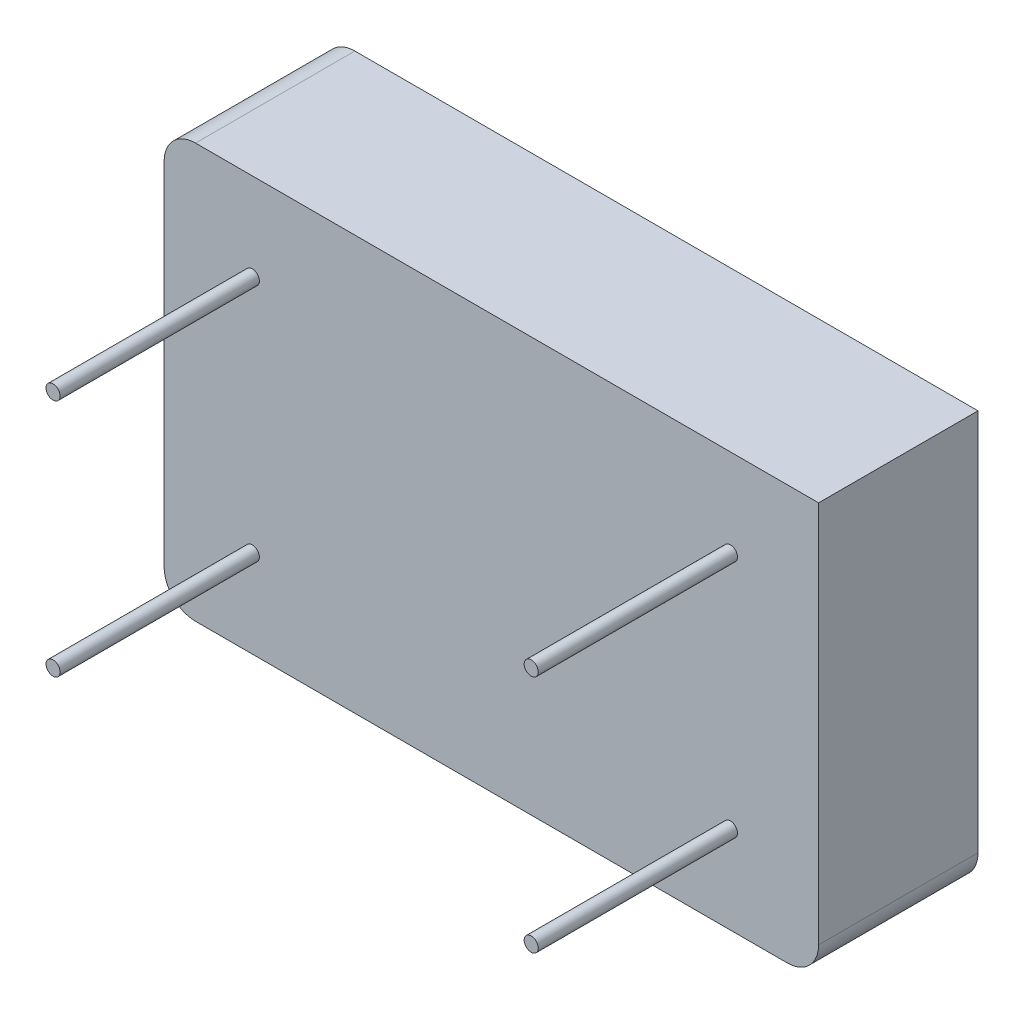
ISO-10303-21;
HEADER;
FILE_DESCRIPTION(('STEP AP214'),'2;1');
FILE_NAME('part.step','',(''),(''),'','','');
FILE_SCHEMA(('AUTOMOTIVE_DESIGN { 1 0 10303 214 1 1 1 1 }'));
ENDSEC;
DATA;
#1=APPLICATION_CONTEXT('core data for automotive mechanical design processes');
#2=APPLICATION_PROTOCOL_DEFINITION('international standard','automotive_design',2000,#1);
#3=PRODUCT_CONTEXT('',#1,'mechanical');
#4=PRODUCT('Part','Part','',(#3));
#5=PRODUCT_RELATED_PRODUCT_CATEGORY('part','',(#4));
#6=PRODUCT_DEFINITION_FORMATION('','',#4);
#7=PRODUCT_DEFINITION_CONTEXT('part definition',#1,'design');
#8=PRODUCT_DEFINITION('design','',#6,#7);
#9=PRODUCT_DEFINITION_SHAPE('','',#8);
#10=(LENGTH_UNIT() NAMED_UNIT(*) SI_UNIT(.MILLI.,.METRE.));
#11=(NAMED_UNIT(*) PLANE_ANGLE_UNIT() SI_UNIT($,.RADIAN.));
#12=(NAMED_UNIT(*) SI_UNIT($,.STERADIAN.) SOLID_ANGLE_UNIT());
#13=UNCERTAINTY_MEASURE_WITH_UNIT(LENGTH_MEASURE(1.E-05),#10,'distance_accuracy_value','');
#14=(GEOMETRIC_REPRESENTATION_CONTEXT(3) GLOBAL_UNCERTAINTY_ASSIGNED_CONTEXT((#13)) GLOBAL_UNIT_ASSIGNED_CONTEXT((#10,
#11,#12)) REPRESENTATION_CONTEXT('',''));
#15=CARTESIAN_POINT('',(0.,0.,0.));
#16=DIRECTION('',(0.,0.,1.));
#17=DIRECTION('',(1.,0.,0.));
#18=AXIS2_PLACEMENT_3D('',#15,#16,#17);
#19=CARTESIAN_POINT('',(0.,0.,5.08));
#20=DIRECTION('',(1.,0.,0.));
#21=DIRECTION('',(0.,0.,-1.));
#22=AXIS2_PLACEMENT_3D('',#19,#20,#21);
#23=PLANE('',#22);
#24=DIRECTION('',(0.,-1.,0.));
#25=VECTOR('',#24,1.);
#26=CARTESIAN_POINT('',(0.,0.,0.));
#27=LINE('',#26,#25);
#28=CARTESIAN_POINT('',(0.,12.2,0.));
#29=VERTEX_POINT('',#28);
#30=CARTESIAN_POINT('',(0.,1.,0.));
#31=VERTEX_POINT('',#30);
#32=EDGE_CURVE('E127',#29,#31,#27,.T.);
#33=ORIENTED_EDGE('',*,*,#32,.T.);
#34=DIRECTION('',(0.,0.,-1.));
#35=VECTOR('',#34,1.);
#36=CARTESIAN_POINT('',(0.,1.,5.08));
#37=LINE('',#36,#35);
#38=CARTESIAN_POINT('',(0.,1.,5.08));
#39=VERTEX_POINT('',#38);
#40=EDGE_CURVE('E46',#31,#39,#37,.F.);
#41=ORIENTED_EDGE('',*,*,#40,.T.);
#42=DIRECTION('',(0.,-1.,0.));
#43=VECTOR('',#42,1.);
#44=CARTESIAN_POINT('',(0.,0.,5.08));
#45=LINE('',#44,#43);
#46=CARTESIAN_POINT('',(0.,12.2,5.08));
#47=VERTEX_POINT('',#46);
#48=EDGE_CURVE('E139',#47,#39,#45,.T.);
#49=ORIENTED_EDGE('',*,*,#48,.F.);
#50=DIRECTION('',(0.,0.,-1.));
#51=VECTOR('',#50,1.);
#52=CARTESIAN_POINT('',(0.,12.2,5.08));
#53=LINE('',#52,#51);
#54=EDGE_CURVE('E182',#47,#29,#53,.T.);
#55=ORIENTED_EDGE('',*,*,#54,.T.);
#56=EDGE_LOOP('',(#33,#41,#49,#55));
#57=FACE_BOUND('',#56,.T.);
#58=ADVANCED_FACE('F37',(#57),#23,.F.);
#59=CARTESIAN_POINT('',(0.,0.,5.08));
#60=DIRECTION('',(0.,1.,0.));
#61=DIRECTION('',(0.,0.,1.));
#62=AXIS2_PLACEMENT_3D('',#59,#60,#61);
#63=PLANE('',#62);
#64=DIRECTION('',(1.,0.,0.));
#65=VECTOR('',#64,1.);
#66=CARTESIAN_POINT('',(0.,0.,0.));
#67=LINE('',#66,#65);
#68=CARTESIAN_POINT('',(1.,0.,0.));
#69=VERTEX_POINT('',#68);
#70=CARTESIAN_POINT('',(19.86,0.,0.));
#71=VERTEX_POINT('',#70);
#72=EDGE_CURVE('E130',#69,#71,#67,.T.);
#73=ORIENTED_EDGE('',*,*,#72,.T.);
#74=DIRECTION('',(0.,0.,-1.));
#75=VECTOR('',#74,1.);
#76=CARTESIAN_POINT('',(19.86,0.,5.08));
#77=LINE('',#76,#75);
#78=CARTESIAN_POINT('',(19.86,0.,5.08));
#79=VERTEX_POINT('',#78);
#80=EDGE_CURVE('E172',#71,#79,#77,.F.);
#81=ORIENTED_EDGE('',*,*,#80,.T.);
#82=DIRECTION('',(1.,0.,0.));
#83=VECTOR('',#82,1.);
#84=CARTESIAN_POINT('',(0.,0.,5.08));
#85=LINE('',#84,#83);
#86=CARTESIAN_POINT('',(1.,0.,5.08));
#87=VERTEX_POINT('',#86);
#88=EDGE_CURVE('E109',#87,#79,#85,.T.);
#89=ORIENTED_EDGE('',*,*,#88,.F.);
#90=DIRECTION('',(0.,0.,-1.));
#91=VECTOR('',#90,1.);
#92=CARTESIAN_POINT('',(1.,0.,5.08));
#93=LINE('',#92,#91);
#94=EDGE_CURVE('E168',#87,#69,#93,.T.);
#95=ORIENTED_EDGE('',*,*,#94,.T.);
#96=EDGE_LOOP('',(#73,#81,#89,#95));
#97=FACE_BOUND('',#96,.T.);
#98=ADVANCED_FACE('F229',(#97),#63,.F.);
#99=CARTESIAN_POINT('',(20.86,0.,5.08));
#100=DIRECTION('',(-1.,0.,0.));
#101=DIRECTION('',(0.,0.,1.));
#102=AXIS2_PLACEMENT_3D('',#99,#100,#101);
#103=PLANE('',#102);
#104=DIRECTION('',(0.,1.,0.));
#105=VECTOR('',#104,1.);
#106=CARTESIAN_POINT('',(20.86,0.,5.08));
#107=LINE('',#106,#105);
#108=CARTESIAN_POINT('',(20.86,1.,5.08));
#109=VERTEX_POINT('',#108);
#110=CARTESIAN_POINT('',(20.86,13.2,5.08));
#111=VERTEX_POINT('',#110);
#112=EDGE_CURVE('E97',#109,#111,#107,.T.);
#113=ORIENTED_EDGE('',*,*,#112,.F.);
#114=DIRECTION('',(0.,0.,-1.));
#115=VECTOR('',#114,1.);
#116=CARTESIAN_POINT('',(20.86,1.,5.08));
#117=LINE('',#116,#115);
#118=CARTESIAN_POINT('',(20.86,1.,0.));
#119=VERTEX_POINT('',#118);
#120=EDGE_CURVE('E156',#109,#119,#117,.T.);
#121=ORIENTED_EDGE('',*,*,#120,.T.);
#122=DIRECTION('',(0.,1.,0.));
#123=VECTOR('',#122,1.);
#124=CARTESIAN_POINT('',(20.86,0.,0.));
#125=LINE('',#124,#123);
#126=CARTESIAN_POINT('',(20.86,13.2,0.));
#127=VERTEX_POINT('',#126);
#128=EDGE_CURVE('E115',#119,#127,#125,.T.);
#129=ORIENTED_EDGE('',*,*,#128,.T.);
#130=DIRECTION('',(0.,0.,-1.));
#131=VECTOR('',#130,1.);
#132=CARTESIAN_POINT('',(20.86,13.2,5.08));
#133=LINE('',#132,#131);
#134=EDGE_CURVE('E112',#111,#127,#133,.T.);
#135=ORIENTED_EDGE('',*,*,#134,.F.);
#136=EDGE_LOOP('',(#113,#121,#129,#135));
#137=FACE_BOUND('',#136,.T.);
#138=ADVANCED_FACE('F113',(#137),#103,.F.);
#139=CARTESIAN_POINT('',(0.,13.2,5.08));
#140=DIRECTION('',(0.,-1.,0.));
#141=DIRECTION('',(0.,0.,-1.));
#142=AXIS2_PLACEMENT_3D('',#139,#140,#141);
#143=PLANE('',#142);
#144=DIRECTION('',(-1.,0.,0.));
#145=VECTOR('',#144,1.);
#146=CARTESIAN_POINT('',(0.,13.2,0.));
#147=LINE('',#146,#145);
#148=CARTESIAN_POINT('',(1.,13.2,0.));
#149=VERTEX_POINT('',#148);
#150=EDGE_CURVE('E137',#127,#149,#147,.T.);
#151=ORIENTED_EDGE('',*,*,#150,.T.);
#152=DIRECTION('',(0.,0.,-1.));
#153=VECTOR('',#152,1.);
#154=CARTESIAN_POINT('',(1.,13.2,5.08));
#155=LINE('',#154,#153);
#156=CARTESIAN_POINT('',(1.,13.2,5.08));
#157=VERTEX_POINT('',#156);
#158=EDGE_CURVE('E11',#149,#157,#155,.F.);
#159=ORIENTED_EDGE('',*,*,#158,.T.);
#160=DIRECTION('',(-1.,0.,0.));
#161=VECTOR('',#160,1.);
#162=CARTESIAN_POINT('',(0.,13.2,5.08));
#163=LINE('',#162,#161);
#164=EDGE_CURVE('E101',#111,#157,#163,.T.);
#165=ORIENTED_EDGE('',*,*,#164,.F.);
#166=ORIENTED_EDGE('',*,*,#134,.T.);
#167=EDGE_LOOP('',(#151,#159,#165,#166));
#168=FACE_BOUND('',#167,.T.);
#169=ADVANCED_FACE('F120',(#168),#143,.F.);
#170=CARTESIAN_POINT('',(0.,0.,5.08));
#171=DIRECTION('',(0.,0.,-1.));
#172=DIRECTION('',(-1.,0.,0.));
#173=AXIS2_PLACEMENT_3D('',#170,#171,#172);
#174=PLANE('',#173);
#175=CARTESIAN_POINT('',(2.81,2.79,5.08));
#176=DIRECTION('',(0.,0.,-1.));
#177=DIRECTION('',(-1.,0.,0.));
#178=AXIS2_PLACEMENT_3D('',#175,#176,#177);
#179=CIRCLE('',#178,0.224999999999999);
#180=CARTESIAN_POINT('',(2.585,2.79,5.08));
#181=VERTEX_POINT('',#180);
#182=EDGE_CURVE('E152',#181,#181,#179,.F.);
#183=ORIENTED_EDGE('',*,*,#182,.F.);
#184=EDGE_LOOP('',(#183));
#185=FACE_BOUND('',#184,.T.);
#186=CARTESIAN_POINT('',(18.05,2.79,5.08));
#187=DIRECTION('',(0.,0.,-1.));
#188=DIRECTION('',(-1.,0.,0.));
#189=AXIS2_PLACEMENT_3D('',#186,#187,#188);
#190=CIRCLE('',#189,0.224999999999997);
#191=CARTESIAN_POINT('',(17.825,2.79,5.08));
#192=VERTEX_POINT('',#191);
#193=EDGE_CURVE('E148',#192,#192,#190,.F.);
#194=ORIENTED_EDGE('',*,*,#193,.F.);
#195=EDGE_LOOP('',(#194));
#196=FACE_BOUND('',#195,.T.);
#197=CARTESIAN_POINT('',(18.05,10.41,5.08));
#198=DIRECTION('',(0.,0.,-1.));
#199=DIRECTION('',(-1.,0.,0.));
#200=AXIS2_PLACEMENT_3D('',#197,#198,#199);
#201=CIRCLE('',#200,0.224999999999997);
#202=CARTESIAN_POINT('',(17.825,10.41,5.08));
#203=VERTEX_POINT('',#202);
#204=EDGE_CURVE('E144',#203,#203,#201,.F.);
#205=ORIENTED_EDGE('',*,*,#204,.F.);
#206=EDGE_LOOP('',(#205));
#207=FACE_BOUND('',#206,.T.);
#208=CARTESIAN_POINT('',(2.81,10.41,5.08));
#209=DIRECTION('',(0.,0.,-1.));
#210=DIRECTION('',(-1.,0.,0.));
#211=AXIS2_PLACEMENT_3D('',#208,#209,#210);
#212=CIRCLE('',#211,0.224999999999999);
#213=CARTESIAN_POINT('',(2.585,10.41,5.08));
#214=VERTEX_POINT('',#213);
#215=EDGE_CURVE('E118',#214,#214,#212,.F.);
#216=ORIENTED_EDGE('',*,*,#215,.F.);
#217=EDGE_LOOP('',(#216));
#218=FACE_BOUND('',#217,.T.);
#219=ORIENTED_EDGE('',*,*,#88,.T.);
#220=CARTESIAN_POINT('',(19.86,1.,5.08));
#221=DIRECTION('',(0.,0.,-1.));
#222=DIRECTION('',(-1.,0.,0.));
#223=AXIS2_PLACEMENT_3D('',#220,#221,#222);
#224=CIRCLE('',#223,1.);
#225=EDGE_CURVE('E104',#79,#109,#224,.F.);
#226=ORIENTED_EDGE('',*,*,#225,.T.);
#227=ORIENTED_EDGE('',*,*,#112,.T.);
#228=ORIENTED_EDGE('',*,*,#164,.T.);
#229=CARTESIAN_POINT('',(1.,12.2,5.08));
#230=DIRECTION('',(0.,0.,-1.));
#231=DIRECTION('',(-1.,0.,0.));
#232=AXIS2_PLACEMENT_3D('',#229,#230,#231);
#233=CIRCLE('',#232,1.);
#234=EDGE_CURVE('E175',#157,#47,#233,.F.);
#235=ORIENTED_EDGE('',*,*,#234,.T.);
#236=ORIENTED_EDGE('',*,*,#48,.T.);
#237=CARTESIAN_POINT('',(1.,1.,5.08));
#238=DIRECTION('',(0.,0.,-1.));
#239=DIRECTION('',(-1.,0.,0.));
#240=AXIS2_PLACEMENT_3D('',#237,#238,#239);
#241=CIRCLE('',#240,1.);
#242=EDGE_CURVE('E178',#39,#87,#241,.F.);
#243=ORIENTED_EDGE('',*,*,#242,.T.);
#244=EDGE_LOOP('',(#219,#226,#227,#228,#235,#236,#243));
#245=FACE_BOUND('',#244,.T.);
#246=ADVANCED_FACE('F100',(#185,#196,#207,#218,#245),#174,.F.);
#247=CARTESIAN_POINT('',(0.,0.,0.));
#248=DIRECTION('',(0.,0.,-1.));
#249=DIRECTION('',(-1.,0.,0.));
#250=AXIS2_PLACEMENT_3D('',#247,#248,#249);
#251=PLANE('',#250);
#252=ORIENTED_EDGE('',*,*,#128,.F.);
#253=CARTESIAN_POINT('',(19.86,1.,0.));
#254=DIRECTION('',(0.,0.,-1.));
#255=DIRECTION('',(-1.,0.,0.));
#256=AXIS2_PLACEMENT_3D('',#253,#254,#255);
#257=CIRCLE('',#256,1.);
#258=EDGE_CURVE('E165',#119,#71,#257,.T.);
#259=ORIENTED_EDGE('',*,*,#258,.T.);
#260=ORIENTED_EDGE('',*,*,#72,.F.);
#261=CARTESIAN_POINT('',(1.,1.,0.));
#262=DIRECTION('',(0.,0.,-1.));
#263=DIRECTION('',(-1.,0.,0.));
#264=AXIS2_PLACEMENT_3D('',#261,#262,#263);
#265=CIRCLE('',#264,1.);
#266=EDGE_CURVE('E162',#69,#31,#265,.T.);
#267=ORIENTED_EDGE('',*,*,#266,.T.);
#268=ORIENTED_EDGE('',*,*,#32,.F.);
#269=CARTESIAN_POINT('',(1.,12.2,0.));
#270=DIRECTION('',(0.,0.,-1.));
#271=DIRECTION('',(-1.,0.,0.));
#272=AXIS2_PLACEMENT_3D('',#269,#270,#271);
#273=CIRCLE('',#272,1.);
#274=EDGE_CURVE('E159',#29,#149,#273,.T.);
#275=ORIENTED_EDGE('',*,*,#274,.T.);
#276=ORIENTED_EDGE('',*,*,#150,.F.);
#277=EDGE_LOOP('',(#252,#259,#260,#267,#268,#275,#276));
#278=FACE_BOUND('',#277,.T.);
#279=ADVANCED_FACE('F212',(#278),#251,.T.);
#280=CARTESIAN_POINT('',(2.81,10.41,11.43));
#281=DIRECTION('',(0.,0.,-1.));
#282=DIRECTION('',(-1.,0.,0.));
#283=AXIS2_PLACEMENT_3D('',#280,#281,#282);
#284=CYLINDRICAL_SURFACE('',#283,0.224999999999999);
#285=CARTESIAN_POINT('',(2.81,10.41,11.43));
#286=DIRECTION('',(0.,0.,1.));
#287=DIRECTION('',(1.,0.,0.));
#288=AXIS2_PLACEMENT_3D('',#285,#286,#287);
#289=CIRCLE('',#288,0.224999999999999);
#290=CARTESIAN_POINT('',(3.035,10.41,11.43));
#291=VERTEX_POINT('',#290);
#292=EDGE_CURVE('E131',#291,#291,#289,.T.);
#293=ORIENTED_EDGE('',*,*,#292,.F.);
#294=EDGE_LOOP('',(#293));
#295=FACE_BOUND('',#294,.T.);
#296=ORIENTED_EDGE('',*,*,#215,.T.);
#297=EDGE_LOOP('',(#296));
#298=FACE_BOUND('',#297,.T.);
#299=ADVANCED_FACE('F209',(#295,#298),#284,.T.);
#300=CARTESIAN_POINT('',(2.81,10.41,11.43));
#301=DIRECTION('',(0.,0.,1.));
#302=DIRECTION('',(1.,0.,0.));
#303=AXIS2_PLACEMENT_3D('',#300,#301,#302);
#304=PLANE('',#303);
#305=ORIENTED_EDGE('',*,*,#292,.T.);
#306=EDGE_LOOP('',(#305));
#307=FACE_BOUND('',#306,.T.);
#308=ADVANCED_FACE('F207',(#307),#304,.T.);
#309=CARTESIAN_POINT('',(18.05,10.41,11.43));
#310=DIRECTION('',(0.,0.,-1.));
#311=DIRECTION('',(-1.,0.,0.));
#312=AXIS2_PLACEMENT_3D('',#309,#310,#311);
#313=CYLINDRICAL_SURFACE('',#312,0.224999999999997);
#314=CARTESIAN_POINT('',(18.05,10.41,11.43));
#315=DIRECTION('',(0.,0.,1.));
#316=DIRECTION('',(-1.,0.,0.));
#317=AXIS2_PLACEMENT_3D('',#314,#315,#316);
#318=CIRCLE('',#317,0.224999999999997);
#319=CARTESIAN_POINT('',(17.825,10.41,11.43));
#320=VERTEX_POINT('',#319);
#321=EDGE_CURVE('E197',#320,#320,#318,.T.);
#322=ORIENTED_EDGE('',*,*,#321,.F.);
#323=EDGE_LOOP('',(#322));
#324=FACE_BOUND('',#323,.T.);
#325=ORIENTED_EDGE('',*,*,#204,.T.);
#326=EDGE_LOOP('',(#325));
#327=FACE_BOUND('',#326,.T.);
#328=ADVANCED_FACE('F311',(#324,#327),#313,.T.);
#329=CARTESIAN_POINT('',(18.05,10.41,11.43));
#330=DIRECTION('',(0.,0.,-1.));
#331=DIRECTION('',(-1.,0.,0.));
#332=AXIS2_PLACEMENT_3D('',#329,#330,#331);
#333=PLANE('',#332);
#334=ORIENTED_EDGE('',*,*,#321,.T.);
#335=EDGE_LOOP('',(#334));
#336=FACE_BOUND('',#335,.T.);
#337=ADVANCED_FACE('F302',(#336),#333,.F.);
#338=CARTESIAN_POINT('',(18.05,2.79,11.43));
#339=DIRECTION('',(0.,0.,-1.));
#340=DIRECTION('',(-1.,0.,0.));
#341=AXIS2_PLACEMENT_3D('',#338,#339,#340);
#342=CYLINDRICAL_SURFACE('',#341,0.224999999999997);
#343=CARTESIAN_POINT('',(18.05,2.79,11.43));
#344=DIRECTION('',(0.,0.,1.));
#345=DIRECTION('',(1.,0.,0.));
#346=AXIS2_PLACEMENT_3D('',#343,#344,#345);
#347=CIRCLE('',#346,0.224999999999997);
#348=CARTESIAN_POINT('',(18.275,2.79,11.43));
#349=VERTEX_POINT('',#348);
#350=EDGE_CURVE('E191',#349,#349,#347,.T.);
#351=ORIENTED_EDGE('',*,*,#350,.F.);
#352=EDGE_LOOP('',(#351));
#353=FACE_BOUND('',#352,.T.);
#354=ORIENTED_EDGE('',*,*,#193,.T.);
#355=EDGE_LOOP('',(#354));
#356=FACE_BOUND('',#355,.T.);
#357=ADVANCED_FACE('F293',(#353,#356),#342,.T.);
#358=CARTESIAN_POINT('',(18.05,2.79,11.43));
#359=DIRECTION('',(0.,0.,1.));
#360=DIRECTION('',(1.,0.,0.));
#361=AXIS2_PLACEMENT_3D('',#358,#359,#360);
#362=PLANE('',#361);
#363=ORIENTED_EDGE('',*,*,#350,.T.);
#364=EDGE_LOOP('',(#363));
#365=FACE_BOUND('',#364,.T.);
#366=ADVANCED_FACE('F284',(#365),#362,.T.);
#367=CARTESIAN_POINT('',(2.81,2.79,11.43));
#368=DIRECTION('',(0.,0.,-1.));
#369=DIRECTION('',(-1.,0.,0.));
#370=AXIS2_PLACEMENT_3D('',#367,#368,#369);
#371=CYLINDRICAL_SURFACE('',#370,0.224999999999999);
#372=CARTESIAN_POINT('',(2.81,2.79,11.43));
#373=DIRECTION('',(0.,0.,1.));
#374=DIRECTION('',(-1.,0.,0.));
#375=AXIS2_PLACEMENT_3D('',#372,#373,#374);
#376=CIRCLE('',#375,0.224999999999999);
#377=CARTESIAN_POINT('',(2.585,2.79,11.43));
#378=VERTEX_POINT('',#377);
#379=EDGE_CURVE('E189',#378,#378,#376,.T.);
#380=ORIENTED_EDGE('',*,*,#379,.F.);
#381=EDGE_LOOP('',(#380));
#382=FACE_BOUND('',#381,.T.);
#383=ORIENTED_EDGE('',*,*,#182,.T.);
#384=EDGE_LOOP('',(#383));
#385=FACE_BOUND('',#384,.T.);
#386=ADVANCED_FACE('F274',(#382,#385),#371,.T.);
#387=CARTESIAN_POINT('',(2.81,2.79,11.43));
#388=DIRECTION('',(0.,0.,-1.));
#389=DIRECTION('',(-1.,0.,0.));
#390=AXIS2_PLACEMENT_3D('',#387,#388,#389);
#391=PLANE('',#390);
#392=ORIENTED_EDGE('',*,*,#379,.T.);
#393=EDGE_LOOP('',(#392));
#394=FACE_BOUND('',#393,.T.);
#395=ADVANCED_FACE('F241',(#394),#391,.F.);
#396=CARTESIAN_POINT('',(19.86,1.,5.08));
#397=DIRECTION('',(0.,0.,-1.));
#398=DIRECTION('',(-1.,0.,0.));
#399=AXIS2_PLACEMENT_3D('',#396,#397,#398);
#400=CYLINDRICAL_SURFACE('',#399,1.);
#401=ORIENTED_EDGE('',*,*,#225,.F.);
#402=ORIENTED_EDGE('',*,*,#80,.F.);
#403=ORIENTED_EDGE('',*,*,#258,.F.);
#404=ORIENTED_EDGE('',*,*,#120,.F.);
#405=EDGE_LOOP('',(#401,#402,#403,#404));
#406=FACE_BOUND('',#405,.T.);
#407=ADVANCED_FACE('F238',(#406),#400,.T.);
#408=CARTESIAN_POINT('',(1.,1.,5.08));
#409=DIRECTION('',(0.,0.,-1.));
#410=DIRECTION('',(-1.,0.,0.));
#411=AXIS2_PLACEMENT_3D('',#408,#409,#410);
#412=CYLINDRICAL_SURFACE('',#411,1.);
#413=ORIENTED_EDGE('',*,*,#242,.F.);
#414=ORIENTED_EDGE('',*,*,#40,.F.);
#415=ORIENTED_EDGE('',*,*,#266,.F.);
#416=ORIENTED_EDGE('',*,*,#94,.F.);
#417=EDGE_LOOP('',(#413,#414,#415,#416));
#418=FACE_BOUND('',#417,.T.);
#419=ADVANCED_FACE('F240',(#418),#412,.T.);
#420=CARTESIAN_POINT('',(1.,12.2,5.08));
#421=DIRECTION('',(0.,0.,-1.));
#422=DIRECTION('',(-1.,0.,0.));
#423=AXIS2_PLACEMENT_3D('',#420,#421,#422);
#424=CYLINDRICAL_SURFACE('',#423,1.);
#425=ORIENTED_EDGE('',*,*,#234,.F.);
#426=ORIENTED_EDGE('',*,*,#158,.F.);
#427=ORIENTED_EDGE('',*,*,#274,.F.);
#428=ORIENTED_EDGE('',*,*,#54,.F.);
#429=EDGE_LOOP('',(#425,#426,#427,#428));
#430=FACE_BOUND('',#429,.T.);
#431=ADVANCED_FACE('F39',(#430),#424,.T.);
#432=CLOSED_SHELL('',(#58,#98,#138,#169,#246,#279,#299,#308,#328,#337,#357,#366,#386,#395,#407,
#419,#431));
#433=MANIFOLD_SOLID_BREP('B2',#432);
#434=ADVANCED_BREP_SHAPE_REPRESENTATION('',(#18,#433),#14);
#435=SHAPE_DEFINITION_REPRESENTATION(#9,#434);
ENDSEC;
END-ISO-10303-21;
